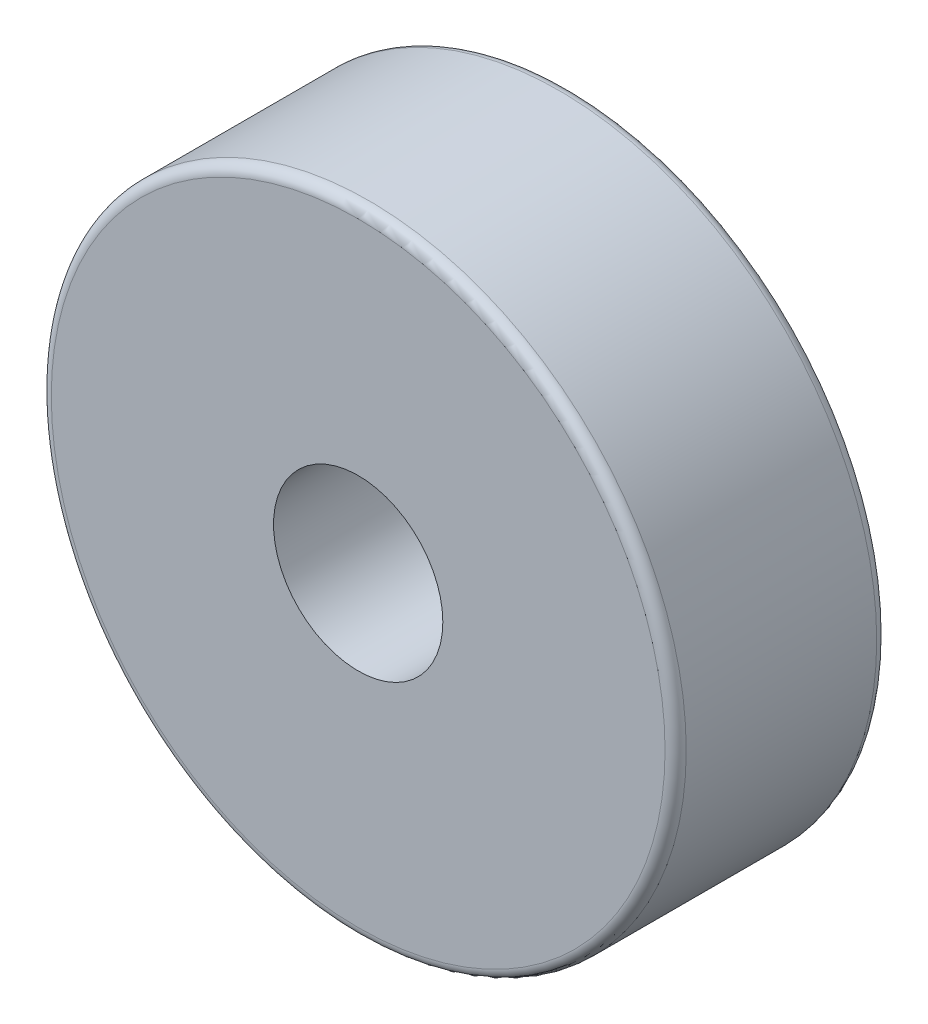
ISO-10303-21;
HEADER;
FILE_DESCRIPTION(('STEP AP214'),'2;1');
FILE_NAME('part.step','',(''),(''),'','','');
FILE_SCHEMA(('AUTOMOTIVE_DESIGN { 1 0 10303 214 1 1 1 1 }'));
ENDSEC;
DATA;
#1=APPLICATION_CONTEXT('core data for automotive mechanical design processes');
#2=APPLICATION_PROTOCOL_DEFINITION('international standard','automotive_design',2000,#1);
#3=PRODUCT_CONTEXT('',#1,'mechanical');
#4=PRODUCT('Part','Part','',(#3));
#5=PRODUCT_RELATED_PRODUCT_CATEGORY('part','',(#4));
#6=PRODUCT_DEFINITION_FORMATION('','',#4);
#7=PRODUCT_DEFINITION_CONTEXT('part definition',#1,'design');
#8=PRODUCT_DEFINITION('design','',#6,#7);
#9=PRODUCT_DEFINITION_SHAPE('','',#8);
#10=(LENGTH_UNIT() NAMED_UNIT(*) SI_UNIT(.MILLI.,.METRE.));
#11=(NAMED_UNIT(*) PLANE_ANGLE_UNIT() SI_UNIT($,.RADIAN.));
#12=(NAMED_UNIT(*) SI_UNIT($,.STERADIAN.) SOLID_ANGLE_UNIT());
#13=UNCERTAINTY_MEASURE_WITH_UNIT(LENGTH_MEASURE(1.E-05),#10,'distance_accuracy_value','');
#14=(GEOMETRIC_REPRESENTATION_CONTEXT(3) GLOBAL_UNCERTAINTY_ASSIGNED_CONTEXT((#13)) GLOBAL_UNIT_ASSIGNED_CONTEXT((#10,
#11,#12)) REPRESENTATION_CONTEXT('',''));
#15=CARTESIAN_POINT('',(0.,0.,0.));
#16=DIRECTION('',(0.,0.,1.));
#17=DIRECTION('',(1.,0.,0.));
#18=AXIS2_PLACEMENT_3D('',#15,#16,#17);
#19=CARTESIAN_POINT('',(0.,0.,10.));
#20=DIRECTION('',(0.,0.,1.));
#21=DIRECTION('',(1.,0.,0.));
#22=AXIS2_PLACEMENT_3D('',#19,#20,#21);
#23=PLANE('',#22);
#24=CARTESIAN_POINT('',(0.,0.,10.));
#25=DIRECTION('',(0.,0.,1.));
#26=DIRECTION('',(1.,0.,0.));
#27=AXIS2_PLACEMENT_3D('',#24,#25,#26);
#28=CIRCLE('',#27,14.5);
#29=CARTESIAN_POINT('',(14.5,0.,10.));
#30=VERTEX_POINT('',#29);
#31=EDGE_CURVE('E10',#30,#30,#28,.T.);
#32=ORIENTED_EDGE('',*,*,#31,.T.);
#33=EDGE_LOOP('',(#32));
#34=FACE_BOUND('',#33,.T.);
#35=CARTESIAN_POINT('',(0.,0.,10.));
#36=DIRECTION('',(0.,0.,1.));
#37=DIRECTION('',(1.,0.,0.));
#38=AXIS2_PLACEMENT_3D('',#35,#36,#37);
#39=CIRCLE('',#38,4.);
#40=CARTESIAN_POINT('',(4.,0.,10.));
#41=VERTEX_POINT('',#40);
#42=EDGE_CURVE('E63',#41,#41,#39,.T.);
#43=ORIENTED_EDGE('',*,*,#42,.F.);
#44=EDGE_LOOP('',(#43));
#45=FACE_BOUND('',#44,.T.);
#46=ADVANCED_FACE('F39',(#34,#45),#23,.T.);
#47=CARTESIAN_POINT('',(0.,0.,0.));
#48=DIRECTION('',(0.,0.,1.));
#49=DIRECTION('',(1.,0.,0.));
#50=AXIS2_PLACEMENT_3D('',#47,#48,#49);
#51=PLANE('',#50);
#52=CARTESIAN_POINT('',(0.,0.,0.));
#53=DIRECTION('',(0.,0.,1.));
#54=DIRECTION('',(1.,0.,0.));
#55=AXIS2_PLACEMENT_3D('',#52,#53,#54);
#56=CIRCLE('',#55,14.5);
#57=CARTESIAN_POINT('',(14.5,0.,0.));
#58=VERTEX_POINT('',#57);
#59=EDGE_CURVE('E47',#58,#58,#56,.F.);
#60=ORIENTED_EDGE('',*,*,#59,.T.);
#61=EDGE_LOOP('',(#60));
#62=FACE_BOUND('',#61,.T.);
#63=CARTESIAN_POINT('',(0.,0.,0.));
#64=DIRECTION('',(0.,0.,1.));
#65=DIRECTION('',(1.,0.,0.));
#66=AXIS2_PLACEMENT_3D('',#63,#64,#65);
#67=CIRCLE('',#66,4.);
#68=CARTESIAN_POINT('',(4.,0.,0.));
#69=VERTEX_POINT('',#68);
#70=EDGE_CURVE('E64',#69,#69,#67,.T.);
#71=ORIENTED_EDGE('',*,*,#70,.T.);
#72=EDGE_LOOP('',(#71));
#73=FACE_BOUND('',#72,.T.);
#74=ADVANCED_FACE('F76',(#62,#73),#51,.F.);
#75=CARTESIAN_POINT('',(0.,0.,10.));
#76=DIRECTION('',(0.,0.,-1.));
#77=DIRECTION('',(-1.,0.,0.));
#78=AXIS2_PLACEMENT_3D('',#75,#76,#77);
#79=CYLINDRICAL_SURFACE('',#78,15.);
#80=CARTESIAN_POINT('',(0.,0.,0.5));
#81=DIRECTION('',(0.,0.,1.));
#82=DIRECTION('',(1.,0.,0.));
#83=AXIS2_PLACEMENT_3D('',#80,#81,#82);
#84=CIRCLE('',#83,15.);
#85=CARTESIAN_POINT('',(15.,0.,0.5));
#86=VERTEX_POINT('',#85);
#87=EDGE_CURVE('E52',#86,#86,#84,.T.);
#88=ORIENTED_EDGE('',*,*,#87,.T.);
#89=EDGE_LOOP('',(#88));
#90=FACE_BOUND('',#89,.T.);
#91=CARTESIAN_POINT('',(0.,0.,9.5));
#92=DIRECTION('',(0.,0.,1.));
#93=DIRECTION('',(1.,0.,0.));
#94=AXIS2_PLACEMENT_3D('',#91,#92,#93);
#95=CIRCLE('',#94,15.);
#96=CARTESIAN_POINT('',(15.,0.,9.5));
#97=VERTEX_POINT('',#96);
#98=EDGE_CURVE('E57',#97,#97,#95,.F.);
#99=ORIENTED_EDGE('',*,*,#98,.T.);
#100=EDGE_LOOP('',(#99));
#101=FACE_BOUND('',#100,.T.);
#102=ADVANCED_FACE('F81',(#90,#101),#79,.T.);
#103=CARTESIAN_POINT('',(0.,0.,10.));
#104=DIRECTION('',(0.,0.,-1.));
#105=DIRECTION('',(-1.,0.,0.));
#106=AXIS2_PLACEMENT_3D('',#103,#104,#105);
#107=CYLINDRICAL_SURFACE('',#106,4.);
#108=ORIENTED_EDGE('',*,*,#42,.T.);
#109=EDGE_LOOP('',(#108));
#110=FACE_BOUND('',#109,.T.);
#111=ORIENTED_EDGE('',*,*,#70,.F.);
#112=EDGE_LOOP('',(#111));
#113=FACE_BOUND('',#112,.T.);
#114=ADVANCED_FACE('F72',(#110,#113),#107,.F.);
#115=CARTESIAN_POINT('',(0.,0.,0.5));
#116=DIRECTION('',(0.,0.,1.));
#117=DIRECTION('',(1.,0.,0.));
#118=AXIS2_PLACEMENT_3D('',#115,#116,#117);
#119=TOROIDAL_SURFACE('',#118,14.5,0.5);
#120=ORIENTED_EDGE('',*,*,#59,.F.);
#121=EDGE_LOOP('',(#120));
#122=FACE_BOUND('',#121,.T.);
#123=ORIENTED_EDGE('',*,*,#87,.F.);
#124=EDGE_LOOP('',(#123));
#125=FACE_BOUND('',#124,.T.);
#126=ADVANCED_FACE('F87',(#122,#125),#119,.T.);
#127=CARTESIAN_POINT('',(0.,0.,9.5));
#128=DIRECTION('',(0.,0.,1.));
#129=DIRECTION('',(1.,0.,0.));
#130=AXIS2_PLACEMENT_3D('',#127,#128,#129);
#131=TOROIDAL_SURFACE('',#130,14.5,0.5);
#132=ORIENTED_EDGE('',*,*,#98,.F.);
#133=EDGE_LOOP('',(#132));
#134=FACE_BOUND('',#133,.T.);
#135=ORIENTED_EDGE('',*,*,#31,.F.);
#136=EDGE_LOOP('',(#135));
#137=FACE_BOUND('',#136,.T.);
#138=ADVANCED_FACE('F41',(#134,#137),#131,.T.);
#139=CLOSED_SHELL('',(#46,#74,#102,#114,#126,#138));
#140=MANIFOLD_SOLID_BREP('B2',#139);
#141=ADVANCED_BREP_SHAPE_REPRESENTATION('',(#18,#140),#14);
#142=SHAPE_DEFINITION_REPRESENTATION(#9,#141);
ENDSEC;
END-ISO-10303-21;
